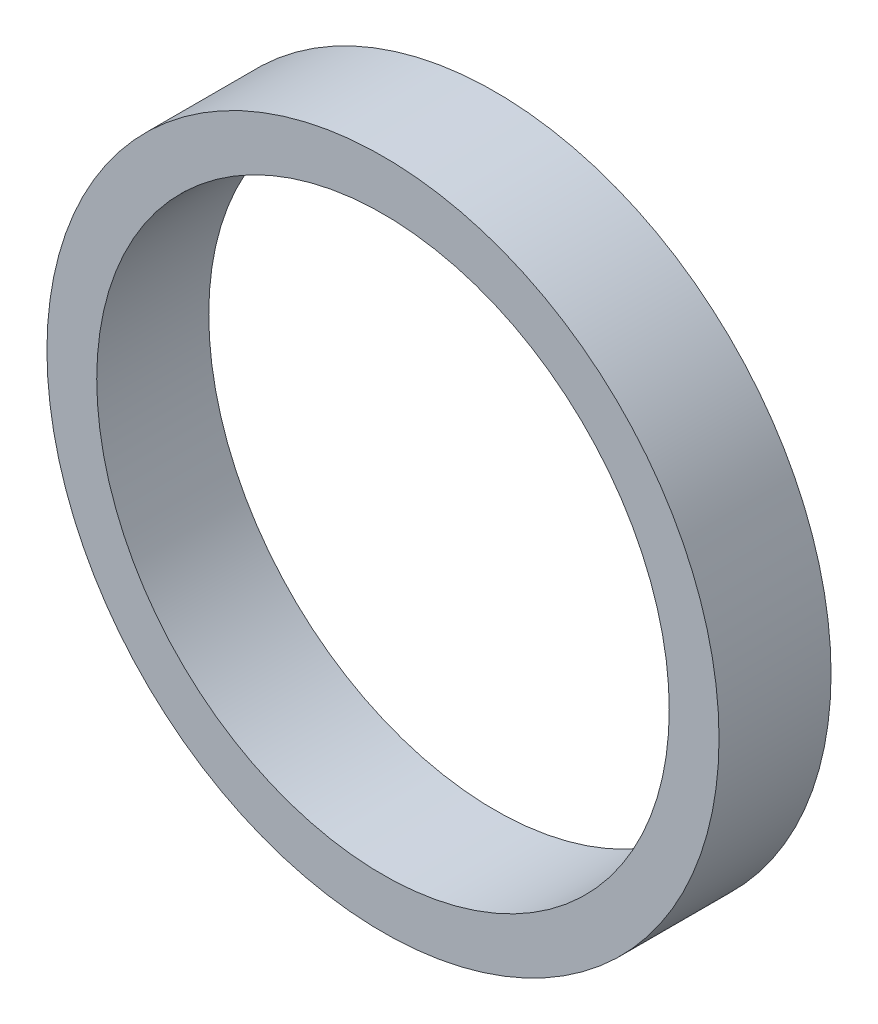
ISO-10303-21;
HEADER;
FILE_DESCRIPTION(('STEP AP214'),'2;1');
FILE_NAME('part.step','',(''),(''),'','','');
FILE_SCHEMA(('AUTOMOTIVE_DESIGN { 1 0 10303 214 1 1 1 1 }'));
ENDSEC;
DATA;
#1=APPLICATION_CONTEXT('core data for automotive mechanical design processes');
#2=APPLICATION_PROTOCOL_DEFINITION('international standard','automotive_design',2000,#1);
#3=PRODUCT_CONTEXT('',#1,'mechanical');
#4=PRODUCT('Part','Part','',(#3));
#5=PRODUCT_RELATED_PRODUCT_CATEGORY('part','',(#4));
#6=PRODUCT_DEFINITION_FORMATION('','',#4);
#7=PRODUCT_DEFINITION_CONTEXT('part definition',#1,'design');
#8=PRODUCT_DEFINITION('design','',#6,#7);
#9=PRODUCT_DEFINITION_SHAPE('','',#8);
#10=(LENGTH_UNIT() NAMED_UNIT(*) SI_UNIT(.MILLI.,.METRE.));
#11=(NAMED_UNIT(*) PLANE_ANGLE_UNIT() SI_UNIT($,.RADIAN.));
#12=(NAMED_UNIT(*) SI_UNIT($,.STERADIAN.) SOLID_ANGLE_UNIT());
#13=UNCERTAINTY_MEASURE_WITH_UNIT(LENGTH_MEASURE(1.E-05),#10,'distance_accuracy_value','');
#14=(GEOMETRIC_REPRESENTATION_CONTEXT(3) GLOBAL_UNCERTAINTY_ASSIGNED_CONTEXT((#13)) GLOBAL_UNIT_ASSIGNED_CONTEXT((#10,
#11,#12)) REPRESENTATION_CONTEXT('',''));
#15=CARTESIAN_POINT('',(0.,0.,0.));
#16=DIRECTION('',(0.,0.,1.));
#17=DIRECTION('',(1.,0.,0.));
#18=AXIS2_PLACEMENT_3D('',#15,#16,#17);
#19=CARTESIAN_POINT('',(0.,11.5,0.));
#20=DIRECTION('',(0.,0.,-1.));
#21=DIRECTION('',(0.,-1.,0.));
#22=AXIS2_PLACEMENT_3D('',#19,#20,#21);
#23=PLANE('',#22);
#24=CARTESIAN_POINT('',(0.,0.,0.));
#25=DIRECTION('',(0.,0.,-1.));
#26=DIRECTION('',(-1.,0.,0.));
#27=AXIS2_PLACEMENT_3D('',#24,#25,#26);
#28=CIRCLE('',#27,11.5);
#29=CARTESIAN_POINT('',(11.5,0.,0.));
#30=VERTEX_POINT('',#29);
#31=EDGE_CURVE('E25',#30,#30,#28,.T.);
#32=ORIENTED_EDGE('',*,*,#31,.F.);
#33=EDGE_LOOP('',(#32));
#34=FACE_BOUND('',#33,.T.);
#35=CARTESIAN_POINT('',(0.,0.,0.));
#36=DIRECTION('',(0.,0.,-1.));
#37=DIRECTION('',(-1.,0.,0.));
#38=AXIS2_PLACEMENT_3D('',#35,#36,#37);
#39=CIRCLE('',#38,13.5);
#40=CARTESIAN_POINT('',(13.5,0.,0.));
#41=VERTEX_POINT('',#40);
#42=EDGE_CURVE('E57',#41,#41,#39,.T.);
#43=ORIENTED_EDGE('',*,*,#42,.T.);
#44=EDGE_LOOP('',(#43));
#45=FACE_BOUND('',#44,.T.);
#46=ADVANCED_FACE('F17',(#34,#45),#23,.T.);
#47=CARTESIAN_POINT('',(0.,0.,-50.));
#48=DIRECTION('',(0.,0.,1.));
#49=DIRECTION('',(-1.,0.,0.));
#50=AXIS2_PLACEMENT_3D('',#47,#48,#49);
#51=CYLINDRICAL_SURFACE('',#50,11.5);
#52=ORIENTED_EDGE('',*,*,#31,.T.);
#53=DIRECTION('',(0.,0.,1.));
#54=VECTOR('',#53,1.);
#55=CARTESIAN_POINT('',(11.5,0.,-50.));
#56=LINE('',#55,#54);
#57=CARTESIAN_POINT('',(11.5,0.,4.5));
#58=VERTEX_POINT('',#57);
#59=EDGE_CURVE('E11',#30,#58,#56,.T.);
#60=ORIENTED_EDGE('',*,*,#59,.T.);
#61=CARTESIAN_POINT('',(0.,0.,4.5));
#62=DIRECTION('',(0.,0.,-1.));
#63=DIRECTION('',(-1.,0.,0.));
#64=AXIS2_PLACEMENT_3D('',#61,#62,#63);
#65=CIRCLE('',#64,11.5);
#66=EDGE_CURVE('E63',#58,#58,#65,.T.);
#67=ORIENTED_EDGE('',*,*,#66,.F.);
#68=ORIENTED_EDGE('',*,*,#59,.F.);
#69=EDGE_LOOP('',(#52,#60,#67,#68));
#70=FACE_BOUND('',#69,.T.);
#71=ADVANCED_FACE('F73',(#70),#51,.F.);
#72=CARTESIAN_POINT('',(0.,13.5,4.5));
#73=DIRECTION('',(0.,0.,1.));
#74=DIRECTION('',(1.,0.,0.));
#75=AXIS2_PLACEMENT_3D('',#72,#73,#74);
#76=PLANE('',#75);
#77=ORIENTED_EDGE('',*,*,#66,.T.);
#78=EDGE_LOOP('',(#77));
#79=FACE_BOUND('',#78,.T.);
#80=CARTESIAN_POINT('',(0.,0.,4.5));
#81=DIRECTION('',(0.,0.,-1.));
#82=DIRECTION('',(-1.,0.,0.));
#83=AXIS2_PLACEMENT_3D('',#80,#81,#82);
#84=CIRCLE('',#83,13.5);
#85=CARTESIAN_POINT('',(13.5,0.,4.5));
#86=VERTEX_POINT('',#85);
#87=EDGE_CURVE('E54',#86,#86,#84,.T.);
#88=ORIENTED_EDGE('',*,*,#87,.F.);
#89=EDGE_LOOP('',(#88));
#90=FACE_BOUND('',#89,.T.);
#91=ADVANCED_FACE('F85',(#79,#90),#76,.T.);
#92=CARTESIAN_POINT('',(0.,0.,-50.));
#93=DIRECTION('',(0.,0.,1.));
#94=DIRECTION('',(-1.,0.,0.));
#95=AXIS2_PLACEMENT_3D('',#92,#93,#94);
#96=CYLINDRICAL_SURFACE('',#95,13.5);
#97=ORIENTED_EDGE('',*,*,#87,.T.);
#98=DIRECTION('',(0.,0.,-1.));
#99=VECTOR('',#98,1.);
#100=CARTESIAN_POINT('',(13.5,0.,-50.));
#101=LINE('',#100,#99);
#102=EDGE_CURVE('E55',#86,#41,#101,.T.);
#103=ORIENTED_EDGE('',*,*,#102,.T.);
#104=ORIENTED_EDGE('',*,*,#42,.F.);
#105=ORIENTED_EDGE('',*,*,#102,.F.);
#106=EDGE_LOOP('',(#97,#103,#104,#105));
#107=FACE_BOUND('',#106,.T.);
#108=ADVANCED_FACE('F52',(#107),#96,.T.);
#109=CLOSED_SHELL('',(#46,#71,#91,#108));
#110=MANIFOLD_SOLID_BREP('B1',#109);
#111=ADVANCED_BREP_SHAPE_REPRESENTATION('',(#18,#110),#14);
#112=SHAPE_DEFINITION_REPRESENTATION(#9,#111);
ENDSEC;
END-ISO-10303-21;
